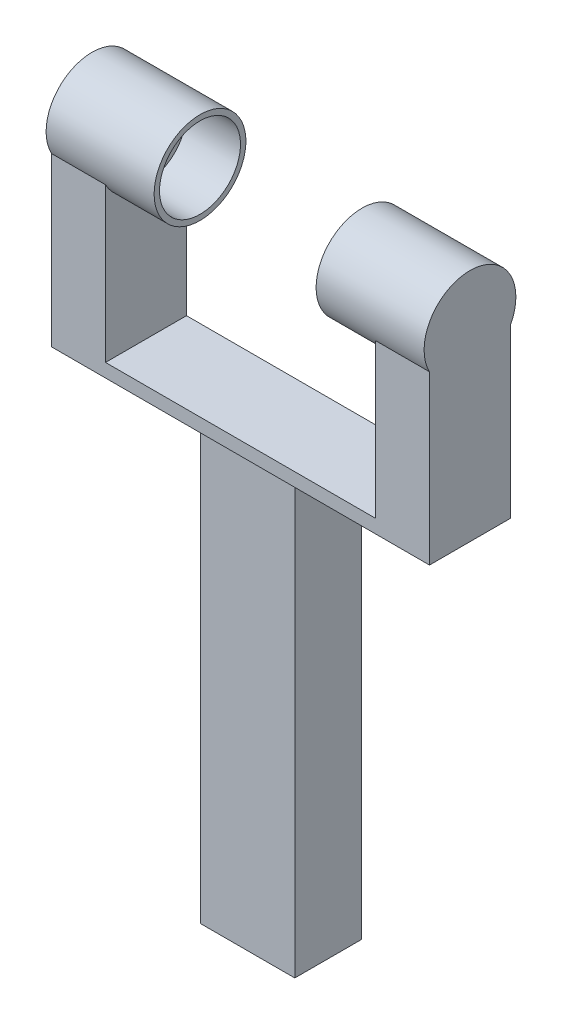
ISO-10303-21;
HEADER;
FILE_DESCRIPTION(('STEP AP214'),'2;1');
FILE_NAME('part.step','',(''),(''),'','','');
FILE_SCHEMA(('AUTOMOTIVE_DESIGN { 1 0 10303 214 1 1 1 1 }'));
ENDSEC;
DATA;
#1=APPLICATION_CONTEXT('core data for automotive mechanical design processes');
#2=APPLICATION_PROTOCOL_DEFINITION('international standard','automotive_design',2000,#1);
#3=PRODUCT_CONTEXT('',#1,'mechanical');
#4=PRODUCT('Part','Part','',(#3));
#5=PRODUCT_RELATED_PRODUCT_CATEGORY('part','',(#4));
#6=PRODUCT_DEFINITION_FORMATION('','',#4);
#7=PRODUCT_DEFINITION_CONTEXT('part definition',#1,'design');
#8=PRODUCT_DEFINITION('design','',#6,#7);
#9=PRODUCT_DEFINITION_SHAPE('','',#8);
#10=(LENGTH_UNIT() NAMED_UNIT(*) SI_UNIT(.MILLI.,.METRE.));
#11=(NAMED_UNIT(*) PLANE_ANGLE_UNIT() SI_UNIT($,.RADIAN.));
#12=(NAMED_UNIT(*) SI_UNIT($,.STERADIAN.) SOLID_ANGLE_UNIT());
#13=UNCERTAINTY_MEASURE_WITH_UNIT(LENGTH_MEASURE(1.E-05),#10,'distance_accuracy_value','');
#14=(GEOMETRIC_REPRESENTATION_CONTEXT(3) GLOBAL_UNCERTAINTY_ASSIGNED_CONTEXT((#13)) GLOBAL_UNIT_ASSIGNED_CONTEXT((#10,
#11,#12)) REPRESENTATION_CONTEXT('',''));
#15=CARTESIAN_POINT('',(0.,0.,0.));
#16=DIRECTION('',(0.,0.,1.));
#17=DIRECTION('',(1.,0.,0.));
#18=AXIS2_PLACEMENT_3D('',#15,#16,#17);
#19=CARTESIAN_POINT('',(0.,-5.,0.));
#20=DIRECTION('',(0.,1.,0.));
#21=DIRECTION('',(0.,0.,1.));
#22=AXIS2_PLACEMENT_3D('',#19,#20,#21);
#23=PLANE('',#22);
#24=DIRECTION('',(0.,0.,-1.));
#25=VECTOR('',#24,1.);
#26=CARTESIAN_POINT('',(70.,-5.,-15.));
#27=LINE('',#26,#25);
#28=CARTESIAN_POINT('',(70.,-5.,15.));
#29=VERTEX_POINT('',#28);
#30=CARTESIAN_POINT('',(70.,-5.,-15.));
#31=VERTEX_POINT('',#30);
#32=EDGE_CURVE('E498',#29,#31,#27,.T.);
#33=ORIENTED_EDGE('',*,*,#32,.F.);
#34=DIRECTION('',(1.,0.,0.));
#35=VECTOR('',#34,1.);
#36=CARTESIAN_POINT('',(-70.,-5.,15.));
#37=LINE('',#36,#35);
#38=CARTESIAN_POINT('',(-70.,-5.,15.));
#39=VERTEX_POINT('',#38);
#40=EDGE_CURVE('E511',#39,#29,#37,.T.);
#41=ORIENTED_EDGE('',*,*,#40,.F.);
#42=DIRECTION('',(0.,0.,1.));
#43=VECTOR('',#42,1.);
#44=CARTESIAN_POINT('',(-70.,-5.,-15.));
#45=LINE('',#44,#43);
#46=CARTESIAN_POINT('',(-70.,-5.,-15.));
#47=VERTEX_POINT('',#46);
#48=EDGE_CURVE('E507',#47,#39,#45,.T.);
#49=ORIENTED_EDGE('',*,*,#48,.F.);
#50=DIRECTION('',(-1.,0.,0.));
#51=VECTOR('',#50,1.);
#52=CARTESIAN_POINT('',(-70.,-5.,-15.));
#53=LINE('',#52,#51);
#54=EDGE_CURVE('E502',#31,#47,#53,.T.);
#55=ORIENTED_EDGE('',*,*,#54,.F.);
#56=EDGE_LOOP('',(#33,#41,#49,#55));
#57=FACE_BOUND('',#56,.T.);
#58=DIRECTION('',(0.,0.,1.));
#59=VECTOR('',#58,1.);
#60=CARTESIAN_POINT('',(17.5,-5.,-12.395));
#61=LINE('',#60,#59);
#62=CARTESIAN_POINT('',(17.5,-5.,-12.395));
#63=VERTEX_POINT('',#62);
#64=CARTESIAN_POINT('',(17.5,-5.,12.395));
#65=VERTEX_POINT('',#64);
#66=EDGE_CURVE('E130',#63,#65,#61,.T.);
#67=ORIENTED_EDGE('',*,*,#66,.F.);
#68=DIRECTION('',(1.,0.,0.));
#69=VECTOR('',#68,1.);
#70=CARTESIAN_POINT('',(-17.5,-5.,-12.395));
#71=LINE('',#70,#69);
#72=CARTESIAN_POINT('',(-17.5,-5.,-12.395));
#73=VERTEX_POINT('',#72);
#74=EDGE_CURVE('E134',#73,#63,#71,.T.);
#75=ORIENTED_EDGE('',*,*,#74,.F.);
#76=DIRECTION('',(0.,0.,-1.));
#77=VECTOR('',#76,1.);
#78=CARTESIAN_POINT('',(-17.5,-5.,-12.395));
#79=LINE('',#78,#77);
#80=CARTESIAN_POINT('',(-17.5,-5.,12.395));
#81=VERTEX_POINT('',#80);
#82=EDGE_CURVE('E1003',#81,#73,#79,.T.);
#83=ORIENTED_EDGE('',*,*,#82,.F.);
#84=DIRECTION('',(-1.,0.,0.));
#85=VECTOR('',#84,1.);
#86=CARTESIAN_POINT('',(-17.5,-5.,12.395));
#87=LINE('',#86,#85);
#88=EDGE_CURVE('E1013',#65,#81,#87,.T.);
#89=ORIENTED_EDGE('',*,*,#88,.F.);
#90=EDGE_LOOP('',(#67,#75,#83,#89));
#91=FACE_BOUND('',#90,.T.);
#92=ADVANCED_FACE('F110',(#57,#91),#23,.F.);
#93=CARTESIAN_POINT('',(-70.,-5.,15.));
#94=DIRECTION('',(0.,0.,1.));
#95=DIRECTION('',(1.,0.,0.));
#96=AXIS2_PLACEMENT_3D('',#93,#94,#95);
#97=PLANE('',#96);
#98=DIRECTION('',(0.,1.,0.));
#99=VECTOR('',#98,1.);
#100=CARTESIAN_POINT('',(70.,-5.,15.));
#101=LINE('',#100,#99);
#102=CARTESIAN_POINT('',(70.,57.,15.));
#103=VERTEX_POINT('',#102);
#104=EDGE_CURVE('E527',#29,#103,#101,.T.);
#105=ORIENTED_EDGE('',*,*,#104,.T.);
#106=DIRECTION('',(1.,0.,0.));
#107=VECTOR('',#106,1.);
#108=CARTESIAN_POINT('',(30.,57.,15.));
#109=LINE('',#108,#107);
#110=CARTESIAN_POINT('',(50.,57.,15.));
#111=VERTEX_POINT('',#110);
#112=EDGE_CURVE('E386',#103,#111,#109,.F.);
#113=ORIENTED_EDGE('',*,*,#112,.T.);
#114=DIRECTION('',(0.,-1.,0.));
#115=VECTOR('',#114,1.);
#116=CARTESIAN_POINT('',(50.,80.,15.));
#117=LINE('',#116,#115);
#118=CARTESIAN_POINT('',(50.,0.,15.));
#119=VERTEX_POINT('',#118);
#120=EDGE_CURVE('E114',#111,#119,#117,.T.);
#121=ORIENTED_EDGE('',*,*,#120,.T.);
#122=DIRECTION('',(1.,0.,0.));
#123=VECTOR('',#122,1.);
#124=CARTESIAN_POINT('',(-70.,0.,15.));
#125=LINE('',#124,#123);
#126=CARTESIAN_POINT('',(-50.,0.,15.));
#127=VERTEX_POINT('',#126);
#128=EDGE_CURVE('E503',#127,#119,#125,.T.);
#129=ORIENTED_EDGE('',*,*,#128,.F.);
#130=DIRECTION('',(0.,-1.,0.));
#131=VECTOR('',#130,1.);
#132=CARTESIAN_POINT('',(-50.,80.,15.));
#133=LINE('',#132,#131);
#134=CARTESIAN_POINT('',(-50.,57.,15.));
#135=VERTEX_POINT('',#134);
#136=EDGE_CURVE('E486',#135,#127,#133,.T.);
#137=ORIENTED_EDGE('',*,*,#136,.F.);
#138=DIRECTION('',(-1.,0.,0.));
#139=VECTOR('',#138,1.);
#140=CARTESIAN_POINT('',(-30.,57.,15.));
#141=LINE('',#140,#139);
#142=CARTESIAN_POINT('',(-70.,57.,15.));
#143=VERTEX_POINT('',#142);
#144=EDGE_CURVE('E448',#143,#135,#141,.F.);
#145=ORIENTED_EDGE('',*,*,#144,.F.);
#146=DIRECTION('',(0.,1.,0.));
#147=VECTOR('',#146,1.);
#148=CARTESIAN_POINT('',(-70.,-5.,15.));
#149=LINE('',#148,#147);
#150=EDGE_CURVE('E532',#39,#143,#149,.T.);
#151=ORIENTED_EDGE('',*,*,#150,.F.);
#152=ORIENTED_EDGE('',*,*,#40,.T.);
#153=EDGE_LOOP('',(#105,#113,#121,#129,#137,#145,#151,#152));
#154=FACE_BOUND('',#153,.T.);
#155=ADVANCED_FACE('F758',(#154),#97,.T.);
#156=CARTESIAN_POINT('',(-70.,-5.,-15.));
#157=DIRECTION('',(0.,0.,-1.));
#158=DIRECTION('',(-1.,0.,0.));
#159=AXIS2_PLACEMENT_3D('',#156,#157,#158);
#160=PLANE('',#159);
#161=DIRECTION('',(0.,-1.,0.));
#162=VECTOR('',#161,1.);
#163=CARTESIAN_POINT('',(50.,80.,-15.));
#164=LINE('',#163,#162);
#165=CARTESIAN_POINT('',(50.,57.,-15.));
#166=VERTEX_POINT('',#165);
#167=CARTESIAN_POINT('',(50.,0.,-15.));
#168=VERTEX_POINT('',#167);
#169=EDGE_CURVE('E605',#166,#168,#164,.T.);
#170=ORIENTED_EDGE('',*,*,#169,.F.);
#171=DIRECTION('',(1.,0.,0.));
#172=VECTOR('',#171,1.);
#173=CARTESIAN_POINT('',(30.,57.,-15.));
#174=LINE('',#173,#172);
#175=CARTESIAN_POINT('',(70.,57.,-15.));
#176=VERTEX_POINT('',#175);
#177=EDGE_CURVE('E382',#166,#176,#174,.T.);
#178=ORIENTED_EDGE('',*,*,#177,.T.);
#179=DIRECTION('',(0.,1.,0.));
#180=VECTOR('',#179,1.);
#181=CARTESIAN_POINT('',(70.,-5.,-15.));
#182=LINE('',#181,#180);
#183=EDGE_CURVE('E515',#31,#176,#182,.T.);
#184=ORIENTED_EDGE('',*,*,#183,.F.);
#185=ORIENTED_EDGE('',*,*,#54,.T.);
#186=DIRECTION('',(0.,1.,0.));
#187=VECTOR('',#186,1.);
#188=CARTESIAN_POINT('',(-70.,-5.,-15.));
#189=LINE('',#188,#187);
#190=CARTESIAN_POINT('',(-70.,57.,-15.));
#191=VERTEX_POINT('',#190);
#192=EDGE_CURVE('E533',#47,#191,#189,.T.);
#193=ORIENTED_EDGE('',*,*,#192,.T.);
#194=DIRECTION('',(-1.,0.,0.));
#195=VECTOR('',#194,1.);
#196=CARTESIAN_POINT('',(-30.,57.,-15.));
#197=LINE('',#196,#195);
#198=CARTESIAN_POINT('',(-50.,57.,-15.));
#199=VERTEX_POINT('',#198);
#200=EDGE_CURVE('E445',#199,#191,#197,.T.);
#201=ORIENTED_EDGE('',*,*,#200,.F.);
#202=DIRECTION('',(0.,-1.,0.));
#203=VECTOR('',#202,1.);
#204=CARTESIAN_POINT('',(-50.,80.,-15.));
#205=LINE('',#204,#203);
#206=CARTESIAN_POINT('',(-50.,0.,-15.));
#207=VERTEX_POINT('',#206);
#208=EDGE_CURVE('E491',#199,#207,#205,.T.);
#209=ORIENTED_EDGE('',*,*,#208,.T.);
#210=DIRECTION('',(-1.,0.,0.));
#211=VECTOR('',#210,1.);
#212=CARTESIAN_POINT('',(-70.,0.,-15.));
#213=LINE('',#212,#211);
#214=EDGE_CURVE('E490',#168,#207,#213,.T.);
#215=ORIENTED_EDGE('',*,*,#214,.F.);
#216=EDGE_LOOP('',(#170,#178,#184,#185,#193,#201,#209,#215));
#217=FACE_BOUND('',#216,.T.);
#218=ADVANCED_FACE('F763',(#217),#160,.T.);
#219=CARTESIAN_POINT('',(50.,80.,-15.));
#220=DIRECTION('',(1.,0.,0.));
#221=DIRECTION('',(0.,0.,-1.));
#222=AXIS2_PLACEMENT_3D('',#219,#220,#221);
#223=PLANE('',#222);
#224=CARTESIAN_POINT('',(50.,65.,0.));
#225=DIRECTION('',(1.,0.,0.));
#226=DIRECTION('',(0.,0.,-1.));
#227=AXIS2_PLACEMENT_3D('',#224,#225,#226);
#228=CIRCLE('',#227,17.);
#229=EDGE_CURVE('E379',#166,#111,#228,.F.);
#230=ORIENTED_EDGE('',*,*,#229,.F.);
#231=ORIENTED_EDGE('',*,*,#169,.T.);
#232=DIRECTION('',(0.,0.,1.));
#233=VECTOR('',#232,1.);
#234=CARTESIAN_POINT('',(50.,0.,-15.));
#235=LINE('',#234,#233);
#236=EDGE_CURVE('E620',#168,#119,#235,.T.);
#237=ORIENTED_EDGE('',*,*,#236,.T.);
#238=ORIENTED_EDGE('',*,*,#120,.F.);
#239=EDGE_LOOP('',(#230,#231,#237,#238));
#240=FACE_BOUND('',#239,.T.);
#241=ADVANCED_FACE('F709',(#240),#223,.F.);
#242=CARTESIAN_POINT('',(0.,0.,0.));
#243=DIRECTION('',(0.,1.,0.));
#244=DIRECTION('',(0.,0.,1.));
#245=AXIS2_PLACEMENT_3D('',#242,#243,#244);
#246=PLANE('',#245);
#247=ORIENTED_EDGE('',*,*,#128,.T.);
#248=ORIENTED_EDGE('',*,*,#236,.F.);
#249=ORIENTED_EDGE('',*,*,#214,.T.);
#250=DIRECTION('',(0.,0.,-1.));
#251=VECTOR('',#250,1.);
#252=CARTESIAN_POINT('',(-50.,0.,-15.));
#253=LINE('',#252,#251);
#254=EDGE_CURVE('E786',#127,#207,#253,.T.);
#255=ORIENTED_EDGE('',*,*,#254,.F.);
#256=EDGE_LOOP('',(#247,#248,#249,#255));
#257=FACE_BOUND('',#256,.T.);
#258=ADVANCED_FACE('F699',(#257),#246,.T.);
#259=CARTESIAN_POINT('',(70.,-5.,-15.));
#260=DIRECTION('',(1.,0.,0.));
#261=DIRECTION('',(0.,0.,-1.));
#262=AXIS2_PLACEMENT_3D('',#259,#260,#261);
#263=PLANE('',#262);
#264=CARTESIAN_POINT('',(70.,65.,0.));
#265=DIRECTION('',(-1.,0.,0.));
#266=DIRECTION('',(0.,0.,1.));
#267=AXIS2_PLACEMENT_3D('',#264,#265,#266);
#268=CIRCLE('',#267,17.);
#269=EDGE_CURVE('E328',#103,#176,#268,.T.);
#270=ORIENTED_EDGE('',*,*,#269,.F.);
#271=ORIENTED_EDGE('',*,*,#104,.F.);
#272=ORIENTED_EDGE('',*,*,#32,.T.);
#273=ORIENTED_EDGE('',*,*,#183,.T.);
#274=EDGE_LOOP('',(#270,#271,#272,#273));
#275=FACE_BOUND('',#274,.T.);
#276=ADVANCED_FACE('F112',(#275),#263,.T.);
#277=CARTESIAN_POINT('',(-70.,-5.,-15.));
#278=DIRECTION('',(-1.,0.,0.));
#279=DIRECTION('',(0.,0.,1.));
#280=AXIS2_PLACEMENT_3D('',#277,#278,#279);
#281=PLANE('',#280);
#282=ORIENTED_EDGE('',*,*,#150,.T.);
#283=CARTESIAN_POINT('',(-70.,65.,0.));
#284=DIRECTION('',(-1.,0.,0.));
#285=DIRECTION('',(0.,0.,1.));
#286=AXIS2_PLACEMENT_3D('',#283,#284,#285);
#287=CIRCLE('',#286,17.);
#288=EDGE_CURVE('E394',#143,#191,#287,.T.);
#289=ORIENTED_EDGE('',*,*,#288,.T.);
#290=ORIENTED_EDGE('',*,*,#192,.F.);
#291=ORIENTED_EDGE('',*,*,#48,.T.);
#292=EDGE_LOOP('',(#282,#289,#290,#291));
#293=FACE_BOUND('',#292,.T.);
#294=ADVANCED_FACE('F754',(#293),#281,.T.);
#295=CARTESIAN_POINT('',(-50.,80.,-15.));
#296=DIRECTION('',(-1.,0.,0.));
#297=DIRECTION('',(0.,0.,1.));
#298=AXIS2_PLACEMENT_3D('',#295,#296,#297);
#299=PLANE('',#298);
#300=ORIENTED_EDGE('',*,*,#208,.F.);
#301=CARTESIAN_POINT('',(-50.,65.,0.));
#302=DIRECTION('',(-1.,0.,0.));
#303=DIRECTION('',(0.,0.,1.));
#304=AXIS2_PLACEMENT_3D('',#301,#302,#303);
#305=CIRCLE('',#304,17.);
#306=EDGE_CURVE('E441',#199,#135,#305,.T.);
#307=ORIENTED_EDGE('',*,*,#306,.T.);
#308=ORIENTED_EDGE('',*,*,#136,.T.);
#309=ORIENTED_EDGE('',*,*,#254,.T.);
#310=EDGE_LOOP('',(#300,#307,#308,#309));
#311=FACE_BOUND('',#310,.T.);
#312=ADVANCED_FACE('F751',(#311),#299,.F.);
#313=CARTESIAN_POINT('',(-30.,65.,0.));
#314=DIRECTION('',(-1.,0.,0.));
#315=DIRECTION('',(0.,0.,1.));
#316=AXIS2_PLACEMENT_3D('',#313,#314,#315);
#317=PLANE('',#316);
#318=CARTESIAN_POINT('',(-30.,65.,0.));
#319=DIRECTION('',(-1.,0.,0.));
#320=DIRECTION('',(0.,0.,1.));
#321=AXIS2_PLACEMENT_3D('',#318,#319,#320);
#322=CIRCLE('',#321,15.);
#323=CARTESIAN_POINT('',(-30.,65.,15.));
#324=VERTEX_POINT('',#323);
#325=EDGE_CURVE('E390',#324,#324,#322,.T.);
#326=ORIENTED_EDGE('',*,*,#325,.T.);
#327=EDGE_LOOP('',(#326));
#328=FACE_BOUND('',#327,.T.);
#329=CARTESIAN_POINT('',(-30.,65.,0.));
#330=DIRECTION('',(-1.,0.,0.));
#331=DIRECTION('',(0.,0.,1.));
#332=AXIS2_PLACEMENT_3D('',#329,#330,#331);
#333=CIRCLE('',#332,17.);
#334=CARTESIAN_POINT('',(-30.,65.,17.));
#335=VERTEX_POINT('',#334);
#336=EDGE_CURVE('E395',#335,#335,#333,.T.);
#337=ORIENTED_EDGE('',*,*,#336,.F.);
#338=EDGE_LOOP('',(#337));
#339=FACE_BOUND('',#338,.T.);
#340=ADVANCED_FACE('F753',(#328,#339),#317,.F.);
#341=CARTESIAN_POINT('',(-30.,65.,0.));
#342=DIRECTION('',(-1.,0.,0.));
#343=DIRECTION('',(0.,0.,1.));
#344=AXIS2_PLACEMENT_3D('',#341,#342,#343);
#345=CYLINDRICAL_SURFACE('',#344,15.);
#346=ORIENTED_EDGE('',*,*,#325,.F.);
#347=EDGE_LOOP('',(#346));
#348=FACE_BOUND('',#347,.T.);
#349=CARTESIAN_POINT('',(-50.,65.,0.));
#350=DIRECTION('',(-1.,0.,0.));
#351=DIRECTION('',(0.,0.,1.));
#352=AXIS2_PLACEMENT_3D('',#349,#350,#351);
#353=CIRCLE('',#352,15.);
#354=CARTESIAN_POINT('',(-50.,65.,15.));
#355=VERTEX_POINT('',#354);
#356=EDGE_CURVE('E399',#355,#355,#353,.T.);
#357=ORIENTED_EDGE('',*,*,#356,.T.);
#358=EDGE_LOOP('',(#357));
#359=FACE_BOUND('',#358,.T.);
#360=ADVANCED_FACE('F1021',(#348,#359),#345,.F.);
#361=CARTESIAN_POINT('',(-30.,65.,0.));
#362=DIRECTION('',(-1.,0.,0.));
#363=DIRECTION('',(0.,0.,1.));
#364=AXIS2_PLACEMENT_3D('',#361,#362,#363);
#365=CYLINDRICAL_SURFACE('',#364,17.);
#366=ORIENTED_EDGE('',*,*,#288,.F.);
#367=ORIENTED_EDGE('',*,*,#144,.T.);
#368=ORIENTED_EDGE('',*,*,#306,.F.);
#369=ORIENTED_EDGE('',*,*,#200,.T.);
#370=EDGE_LOOP('',(#366,#367,#368,#369));
#371=FACE_BOUND('',#370,.T.);
#372=ORIENTED_EDGE('',*,*,#336,.T.);
#373=EDGE_LOOP('',(#372));
#374=FACE_BOUND('',#373,.T.);
#375=ADVANCED_FACE('F723',(#371,#374),#365,.T.);
#376=ORIENTED_EDGE('',*,*,#356,.F.);
#377=EDGE_LOOP('',(#376));
#378=FACE_BOUND('',#377,.T.);
#379=ADVANCED_FACE('F756',(#378),#299,.F.);
#380=CARTESIAN_POINT('',(30.,65.,0.));
#381=DIRECTION('',(-1.,0.,0.));
#382=DIRECTION('',(0.,0.,1.));
#383=AXIS2_PLACEMENT_3D('',#380,#381,#382);
#384=PLANE('',#383);
#385=CARTESIAN_POINT('',(30.,65.,0.));
#386=DIRECTION('',(-1.,0.,0.));
#387=DIRECTION('',(0.,0.,1.));
#388=AXIS2_PLACEMENT_3D('',#385,#386,#387);
#389=CIRCLE('',#388,17.);
#390=CARTESIAN_POINT('',(30.,65.,17.));
#391=VERTEX_POINT('',#390);
#392=EDGE_CURVE('E334',#391,#391,#389,.T.);
#393=ORIENTED_EDGE('',*,*,#392,.T.);
#394=EDGE_LOOP('',(#393));
#395=FACE_BOUND('',#394,.T.);
#396=CARTESIAN_POINT('',(30.,65.,0.));
#397=DIRECTION('',(-1.,0.,0.));
#398=DIRECTION('',(0.,0.,1.));
#399=AXIS2_PLACEMENT_3D('',#396,#397,#398);
#400=CIRCLE('',#399,15.);
#401=CARTESIAN_POINT('',(30.,65.,15.));
#402=VERTEX_POINT('',#401);
#403=EDGE_CURVE('E323',#402,#402,#400,.T.);
#404=ORIENTED_EDGE('',*,*,#403,.F.);
#405=EDGE_LOOP('',(#404));
#406=FACE_BOUND('',#405,.T.);
#407=ADVANCED_FACE('F846',(#395,#406),#384,.T.);
#408=CARTESIAN_POINT('',(30.,65.,0.));
#409=DIRECTION('',(1.,0.,0.));
#410=DIRECTION('',(0.,0.,-1.));
#411=AXIS2_PLACEMENT_3D('',#408,#409,#410);
#412=CYLINDRICAL_SURFACE('',#411,15.);
#413=ORIENTED_EDGE('',*,*,#403,.T.);
#414=EDGE_LOOP('',(#413));
#415=FACE_BOUND('',#414,.T.);
#416=CARTESIAN_POINT('',(50.,65.,0.));
#417=DIRECTION('',(1.,0.,0.));
#418=DIRECTION('',(0.,0.,-1.));
#419=AXIS2_PLACEMENT_3D('',#416,#417,#418);
#420=CIRCLE('',#419,15.);
#421=CARTESIAN_POINT('',(50.,65.,-15.));
#422=VERTEX_POINT('',#421);
#423=EDGE_CURVE('E338',#422,#422,#420,.F.);
#424=ORIENTED_EDGE('',*,*,#423,.F.);
#425=EDGE_LOOP('',(#424));
#426=FACE_BOUND('',#425,.T.);
#427=ADVANCED_FACE('F694',(#415,#426),#412,.F.);
#428=CARTESIAN_POINT('',(30.,65.,0.));
#429=DIRECTION('',(1.,0.,0.));
#430=DIRECTION('',(0.,0.,-1.));
#431=AXIS2_PLACEMENT_3D('',#428,#429,#430);
#432=CYLINDRICAL_SURFACE('',#431,17.);
#433=ORIENTED_EDGE('',*,*,#112,.F.);
#434=ORIENTED_EDGE('',*,*,#269,.T.);
#435=ORIENTED_EDGE('',*,*,#177,.F.);
#436=ORIENTED_EDGE('',*,*,#229,.T.);
#437=EDGE_LOOP('',(#433,#434,#435,#436));
#438=FACE_BOUND('',#437,.T.);
#439=ORIENTED_EDGE('',*,*,#392,.F.);
#440=EDGE_LOOP('',(#439));
#441=FACE_BOUND('',#440,.T.);
#442=ADVANCED_FACE('F682',(#438,#441),#432,.T.);
#443=ORIENTED_EDGE('',*,*,#423,.T.);
#444=EDGE_LOOP('',(#443));
#445=FACE_BOUND('',#444,.T.);
#446=ADVANCED_FACE('F693',(#445),#223,.F.);
#447=CARTESIAN_POINT('',(17.5,-165.,-12.395));
#448=DIRECTION('',(-1.,0.,0.));
#449=DIRECTION('',(0.,0.,1.));
#450=AXIS2_PLACEMENT_3D('',#447,#448,#449);
#451=PLANE('',#450);
#452=ORIENTED_EDGE('',*,*,#66,.T.);
#453=DIRECTION('',(0.,1.,0.));
#454=VECTOR('',#453,1.);
#455=CARTESIAN_POINT('',(17.5,-165.,12.395));
#456=LINE('',#455,#454);
#457=CARTESIAN_POINT('',(17.5,-165.,12.395));
#458=VERTEX_POINT('',#457);
#459=EDGE_CURVE('E303',#458,#65,#456,.T.);
#460=ORIENTED_EDGE('',*,*,#459,.F.);
#461=DIRECTION('',(0.,0.,1.));
#462=VECTOR('',#461,1.);
#463=CARTESIAN_POINT('',(17.5,-165.,-12.395));
#464=LINE('',#463,#462);
#465=CARTESIAN_POINT('',(17.5,-165.,-12.395));
#466=VERTEX_POINT('',#465);
#467=EDGE_CURVE('E310',#466,#458,#464,.T.);
#468=ORIENTED_EDGE('',*,*,#467,.F.);
#469=DIRECTION('',(0.,1.,0.));
#470=VECTOR('',#469,1.);
#471=CARTESIAN_POINT('',(17.5,-165.,-12.395));
#472=LINE('',#471,#470);
#473=EDGE_CURVE('E1000',#466,#63,#472,.T.);
#474=ORIENTED_EDGE('',*,*,#473,.T.);
#475=EDGE_LOOP('',(#452,#460,#468,#474));
#476=FACE_BOUND('',#475,.T.);
#477=ADVANCED_FACE('F321',(#476),#451,.F.);
#478=CARTESIAN_POINT('',(-17.5,-165.,12.395));
#479=DIRECTION('',(0.,0.,-1.));
#480=DIRECTION('',(-1.,0.,0.));
#481=AXIS2_PLACEMENT_3D('',#478,#479,#480);
#482=PLANE('',#481);
#483=ORIENTED_EDGE('',*,*,#88,.T.);
#484=DIRECTION('',(0.,1.,0.));
#485=VECTOR('',#484,1.);
#486=CARTESIAN_POINT('',(-17.5,-165.,12.395));
#487=LINE('',#486,#485);
#488=CARTESIAN_POINT('',(-17.5,-165.,12.395));
#489=VERTEX_POINT('',#488);
#490=EDGE_CURVE('E305',#489,#81,#487,.T.);
#491=ORIENTED_EDGE('',*,*,#490,.F.);
#492=DIRECTION('',(-1.,0.,0.));
#493=VECTOR('',#492,1.);
#494=CARTESIAN_POINT('',(-17.5,-165.,12.395));
#495=LINE('',#494,#493);
#496=EDGE_CURVE('E298',#458,#489,#495,.T.);
#497=ORIENTED_EDGE('',*,*,#496,.F.);
#498=ORIENTED_EDGE('',*,*,#459,.T.);
#499=EDGE_LOOP('',(#483,#491,#497,#498));
#500=FACE_BOUND('',#499,.T.);
#501=ADVANCED_FACE('F301',(#500),#482,.F.);
#502=CARTESIAN_POINT('',(-17.5,-165.,-12.395));
#503=DIRECTION('',(1.,0.,0.));
#504=DIRECTION('',(0.,0.,-1.));
#505=AXIS2_PLACEMENT_3D('',#502,#503,#504);
#506=PLANE('',#505);
#507=ORIENTED_EDGE('',*,*,#82,.T.);
#508=DIRECTION('',(0.,1.,0.));
#509=VECTOR('',#508,1.);
#510=CARTESIAN_POINT('',(-17.5,-165.,-12.395));
#511=LINE('',#510,#509);
#512=CARTESIAN_POINT('',(-17.5,-165.,-12.395));
#513=VERTEX_POINT('',#512);
#514=EDGE_CURVE('E330',#513,#73,#511,.T.);
#515=ORIENTED_EDGE('',*,*,#514,.F.);
#516=DIRECTION('',(0.,0.,-1.));
#517=VECTOR('',#516,1.);
#518=CARTESIAN_POINT('',(-17.5,-165.,-12.395));
#519=LINE('',#518,#517);
#520=EDGE_CURVE('E309',#489,#513,#519,.T.);
#521=ORIENTED_EDGE('',*,*,#520,.F.);
#522=ORIENTED_EDGE('',*,*,#490,.T.);
#523=EDGE_LOOP('',(#507,#515,#521,#522));
#524=FACE_BOUND('',#523,.T.);
#525=ADVANCED_FACE('F969',(#524),#506,.F.);
#526=CARTESIAN_POINT('',(-17.5,-165.,-12.395));
#527=DIRECTION('',(0.,0.,1.));
#528=DIRECTION('',(1.,0.,0.));
#529=AXIS2_PLACEMENT_3D('',#526,#527,#528);
#530=PLANE('',#529);
#531=ORIENTED_EDGE('',*,*,#74,.T.);
#532=ORIENTED_EDGE('',*,*,#473,.F.);
#533=DIRECTION('',(1.,0.,0.));
#534=VECTOR('',#533,1.);
#535=CARTESIAN_POINT('',(-17.5,-165.,-12.395));
#536=LINE('',#535,#534);
#537=EDGE_CURVE('E315',#513,#466,#536,.T.);
#538=ORIENTED_EDGE('',*,*,#537,.F.);
#539=ORIENTED_EDGE('',*,*,#514,.T.);
#540=EDGE_LOOP('',(#531,#532,#538,#539));
#541=FACE_BOUND('',#540,.T.);
#542=ADVANCED_FACE('F978',(#541),#530,.F.);
#543=CARTESIAN_POINT('',(0.,-165.,0.));
#544=DIRECTION('',(0.,1.,0.));
#545=DIRECTION('',(0.,0.,1.));
#546=AXIS2_PLACEMENT_3D('',#543,#544,#545);
#547=PLANE('',#546);
#548=ORIENTED_EDGE('',*,*,#467,.T.);
#549=ORIENTED_EDGE('',*,*,#496,.T.);
#550=ORIENTED_EDGE('',*,*,#520,.T.);
#551=ORIENTED_EDGE('',*,*,#537,.T.);
#552=EDGE_LOOP('',(#548,#549,#550,#551));
#553=FACE_BOUND('',#552,.T.);
#554=ADVANCED_FACE('F313',(#553),#547,.F.);
#555=CLOSED_SHELL('',(#92,#155,#218,#241,#258,#276,#294,#312,#340,#360,#375,#379,#407,#427,#442,
#446,#477,#501,#525,#542,#554));
#556=DIRECTION('',(0.,0.,-1.));
#557=VECTOR('',#556,1.);
#558=CARTESIAN_POINT('',(68.,0.,0.));
#559=LINE('',#558,#557);
#560=CARTESIAN_POINT('',(68.,0.,13.));
#561=VERTEX_POINT('',#560);
#562=CARTESIAN_POINT('',(68.,0.,-13.));
#563=VERTEX_POINT('',#562);
#564=EDGE_CURVE('E451',#561,#563,#559,.T.);
#565=ORIENTED_EDGE('',*,*,#564,.T.);
#566=DIRECTION('',(-1.,0.,0.));
#567=VECTOR('',#566,1.);
#568=CARTESIAN_POINT('',(0.,0.,-13.));
#569=LINE('',#568,#567);
#570=CARTESIAN_POINT('',(52.,0.,-13.));
#571=VERTEX_POINT('',#570);
#572=EDGE_CURVE('E455',#563,#571,#569,.T.);
#573=ORIENTED_EDGE('',*,*,#572,.T.);
#574=DIRECTION('',(0.,0.,1.));
#575=VECTOR('',#574,1.);
#576=CARTESIAN_POINT('',(52.,0.,0.));
#577=LINE('',#576,#575);
#578=CARTESIAN_POINT('',(52.,0.,13.));
#579=VERTEX_POINT('',#578);
#580=EDGE_CURVE('E459',#571,#579,#577,.T.);
#581=ORIENTED_EDGE('',*,*,#580,.T.);
#582=DIRECTION('',(1.,0.,0.));
#583=VECTOR('',#582,1.);
#584=CARTESIAN_POINT('',(0.,0.,13.));
#585=LINE('',#584,#583);
#586=EDGE_CURVE('E463',#579,#561,#585,.T.);
#587=ORIENTED_EDGE('',*,*,#586,.T.);
#588=EDGE_LOOP('',(#565,#573,#581,#587));
#589=FACE_BOUND('',#588,.T.);
#590=ADVANCED_FACE('F668',(#589),#246,.T.);
#591=CARTESIAN_POINT('',(0.,80.,13.));
#592=DIRECTION('',(0.,0.,-1.));
#593=DIRECTION('',(-1.,0.,0.));
#594=AXIS2_PLACEMENT_3D('',#591,#592,#593);
#595=PLANE('',#594);
#596=DIRECTION('',(0.,-1.,0.));
#597=VECTOR('',#596,1.);
#598=CARTESIAN_POINT('',(52.,80.,13.));
#599=LINE('',#598,#597);
#600=CARTESIAN_POINT('',(52.,54.0455488498967,13.));
#601=VERTEX_POINT('',#600);
#602=EDGE_CURVE('E478',#601,#579,#599,.T.);
#603=ORIENTED_EDGE('',*,*,#602,.F.);
#604=DIRECTION('',(1.,0.,0.));
#605=VECTOR('',#604,1.);
#606=CARTESIAN_POINT('',(30.,54.0455488498967,13.));
#607=LINE('',#606,#605);
#608=CARTESIAN_POINT('',(68.,54.0455488498967,13.));
#609=VERTEX_POINT('',#608);
#610=EDGE_CURVE('E14',#601,#609,#607,.T.);
#611=ORIENTED_EDGE('',*,*,#610,.T.);
#612=DIRECTION('',(0.,-1.,0.));
#613=VECTOR('',#612,1.);
#614=CARTESIAN_POINT('',(68.,80.,13.));
#615=LINE('',#614,#613);
#616=EDGE_CURVE('E467',#609,#561,#615,.T.);
#617=ORIENTED_EDGE('',*,*,#616,.T.);
#618=ORIENTED_EDGE('',*,*,#586,.F.);
#619=EDGE_LOOP('',(#603,#611,#617,#618));
#620=FACE_BOUND('',#619,.T.);
#621=ADVANCED_FACE('F674',(#620),#595,.T.);
#622=CARTESIAN_POINT('',(52.,80.,0.));
#623=DIRECTION('',(1.,0.,0.));
#624=DIRECTION('',(0.,0.,-1.));
#625=AXIS2_PLACEMENT_3D('',#622,#623,#624);
#626=PLANE('',#625);
#627=DIRECTION('',(0.,-1.,0.));
#628=VECTOR('',#627,1.);
#629=CARTESIAN_POINT('',(52.,80.,-13.));
#630=LINE('',#629,#628);
#631=CARTESIAN_POINT('',(52.,54.0455488498967,-13.));
#632=VERTEX_POINT('',#631);
#633=EDGE_CURVE('E485',#632,#571,#630,.T.);
#634=ORIENTED_EDGE('',*,*,#633,.F.);
#635=CARTESIAN_POINT('',(52.,65.,0.));
#636=DIRECTION('',(1.,0.,0.));
#637=DIRECTION('',(0.,0.,-1.));
#638=AXIS2_PLACEMENT_3D('',#635,#636,#637);
#639=CIRCLE('',#638,17.);
#640=EDGE_CURVE('E367',#632,#601,#639,.F.);
#641=ORIENTED_EDGE('',*,*,#640,.T.);
#642=ORIENTED_EDGE('',*,*,#602,.T.);
#643=ORIENTED_EDGE('',*,*,#580,.F.);
#644=EDGE_LOOP('',(#634,#641,#642,#643));
#645=FACE_BOUND('',#644,.T.);
#646=ADVANCED_FACE('F671',(#645),#626,.T.);
#647=CARTESIAN_POINT('',(0.,80.,-13.));
#648=DIRECTION('',(0.,0.,1.));
#649=DIRECTION('',(1.,0.,0.));
#650=AXIS2_PLACEMENT_3D('',#647,#648,#649);
#651=PLANE('',#650);
#652=DIRECTION('',(0.,-1.,0.));
#653=VECTOR('',#652,1.);
#654=CARTESIAN_POINT('',(68.,80.,-13.));
#655=LINE('',#654,#653);
#656=CARTESIAN_POINT('',(68.,54.0455488498967,-13.));
#657=VERTEX_POINT('',#656);
#658=EDGE_CURVE('E611',#657,#563,#655,.T.);
#659=ORIENTED_EDGE('',*,*,#658,.F.);
#660=DIRECTION('',(1.,0.,0.));
#661=VECTOR('',#660,1.);
#662=CARTESIAN_POINT('',(30.,54.0455488498967,-13.));
#663=LINE('',#662,#661);
#664=EDGE_CURVE('E371',#657,#632,#663,.F.);
#665=ORIENTED_EDGE('',*,*,#664,.T.);
#666=ORIENTED_EDGE('',*,*,#633,.T.);
#667=ORIENTED_EDGE('',*,*,#572,.F.);
#668=EDGE_LOOP('',(#659,#665,#666,#667));
#669=FACE_BOUND('',#668,.T.);
#670=ADVANCED_FACE('F664',(#669),#651,.T.);
#671=CARTESIAN_POINT('',(68.,80.,0.));
#672=DIRECTION('',(-1.,0.,0.));
#673=DIRECTION('',(0.,0.,1.));
#674=AXIS2_PLACEMENT_3D('',#671,#672,#673);
#675=PLANE('',#674);
#676=ORIENTED_EDGE('',*,*,#616,.F.);
#677=CARTESIAN_POINT('',(68.,65.,0.));
#678=DIRECTION('',(-1.,0.,0.));
#679=DIRECTION('',(0.,0.,1.));
#680=AXIS2_PLACEMENT_3D('',#677,#678,#679);
#681=CIRCLE('',#680,17.);
#682=EDGE_CURVE('E375',#609,#657,#681,.F.);
#683=ORIENTED_EDGE('',*,*,#682,.T.);
#684=ORIENTED_EDGE('',*,*,#658,.T.);
#685=ORIENTED_EDGE('',*,*,#564,.F.);
#686=EDGE_LOOP('',(#676,#683,#684,#685));
#687=FACE_BOUND('',#686,.T.);
#688=ADVANCED_FACE('F677',(#687),#675,.T.);
#689=ORIENTED_EDGE('',*,*,#682,.F.);
#690=ORIENTED_EDGE('',*,*,#610,.F.);
#691=ORIENTED_EDGE('',*,*,#640,.F.);
#692=ORIENTED_EDGE('',*,*,#664,.F.);
#693=EDGE_LOOP('',(#689,#690,#691,#692));
#694=FACE_BOUND('',#693,.T.);
#695=ADVANCED_FACE('F679',(#694),#432,.T.);
#696=CLOSED_SHELL('',(#590,#621,#646,#670,#688,#695));
#697=DIRECTION('',(1.,0.,0.));
#698=VECTOR('',#697,1.);
#699=CARTESIAN_POINT('',(30.,57.5166852264521,13.));
#700=LINE('',#699,#698);
#701=CARTESIAN_POINT('',(52.,57.5166852264521,13.));
#702=VERTEX_POINT('',#701);
#703=CARTESIAN_POINT('',(68.,57.5166852264521,13.));
#704=VERTEX_POINT('',#703);
#705=EDGE_CURVE('E351',#702,#704,#700,.T.);
#706=ORIENTED_EDGE('',*,*,#705,.T.);
#707=CARTESIAN_POINT('',(68.,65.,0.));
#708=DIRECTION('',(-1.,0.,0.));
#709=DIRECTION('',(0.,0.,1.));
#710=AXIS2_PLACEMENT_3D('',#707,#708,#709);
#711=CIRCLE('',#710,15.);
#712=CARTESIAN_POINT('',(68.,57.5166852264521,-13.));
#713=VERTEX_POINT('',#712);
#714=EDGE_CURVE('E366',#704,#713,#711,.F.);
#715=ORIENTED_EDGE('',*,*,#714,.T.);
#716=DIRECTION('',(1.,0.,0.));
#717=VECTOR('',#716,1.);
#718=CARTESIAN_POINT('',(30.,57.5166852264521,-13.));
#719=LINE('',#718,#717);
#720=CARTESIAN_POINT('',(52.,57.5166852264521,-13.));
#721=VERTEX_POINT('',#720);
#722=EDGE_CURVE('E350',#713,#721,#719,.F.);
#723=ORIENTED_EDGE('',*,*,#722,.T.);
#724=CARTESIAN_POINT('',(52.,65.,0.));
#725=DIRECTION('',(1.,0.,0.));
#726=DIRECTION('',(0.,0.,-1.));
#727=AXIS2_PLACEMENT_3D('',#724,#725,#726);
#728=CIRCLE('',#727,15.);
#729=EDGE_CURVE('E345',#721,#702,#728,.F.);
#730=ORIENTED_EDGE('',*,*,#729,.T.);
#731=EDGE_LOOP('',(#706,#715,#723,#730));
#732=FACE_BOUND('',#731,.T.);
#733=ADVANCED_FACE('F641',(#732),#412,.F.);
#734=DIRECTION('',(1.,0.,0.));
#735=VECTOR('',#734,1.);
#736=CARTESIAN_POINT('',(30.,72.4833147735479,13.));
#737=LINE('',#736,#735);
#738=CARTESIAN_POINT('',(68.,72.4833147735479,13.));
#739=VERTEX_POINT('',#738);
#740=CARTESIAN_POINT('',(52.,72.4833147735479,13.));
#741=VERTEX_POINT('',#740);
#742=EDGE_CURVE('E358',#739,#741,#737,.F.);
#743=ORIENTED_EDGE('',*,*,#742,.F.);
#744=EDGE_CURVE('E475',#739,#704,#615,.T.);
#745=ORIENTED_EDGE('',*,*,#744,.T.);
#746=ORIENTED_EDGE('',*,*,#705,.F.);
#747=EDGE_CURVE('E481',#741,#702,#599,.T.);
#748=ORIENTED_EDGE('',*,*,#747,.F.);
#749=EDGE_LOOP('',(#743,#745,#746,#748));
#750=FACE_BOUND('',#749,.T.);
#751=ADVANCED_FACE('F705',(#750),#595,.T.);
#752=ORIENTED_EDGE('',*,*,#729,.F.);
#753=CARTESIAN_POINT('',(52.,72.4833147735479,-13.));
#754=VERTEX_POINT('',#753);
#755=EDGE_CURVE('E616',#754,#721,#630,.T.);
#756=ORIENTED_EDGE('',*,*,#755,.F.);
#757=EDGE_CURVE('E354',#741,#754,#728,.F.);
#758=ORIENTED_EDGE('',*,*,#757,.F.);
#759=ORIENTED_EDGE('',*,*,#747,.T.);
#760=EDGE_LOOP('',(#752,#756,#758,#759));
#761=FACE_BOUND('',#760,.T.);
#762=ADVANCED_FACE('F656',(#761),#626,.T.);
#763=ORIENTED_EDGE('',*,*,#722,.F.);
#764=CARTESIAN_POINT('',(68.,72.4833147735479,-13.));
#765=VERTEX_POINT('',#764);
#766=EDGE_CURVE('E615',#765,#713,#655,.T.);
#767=ORIENTED_EDGE('',*,*,#766,.F.);
#768=DIRECTION('',(1.,0.,0.));
#769=VECTOR('',#768,1.);
#770=CARTESIAN_POINT('',(30.,72.4833147735479,-13.));
#771=LINE('',#770,#769);
#772=EDGE_CURVE('E344',#754,#765,#771,.T.);
#773=ORIENTED_EDGE('',*,*,#772,.F.);
#774=ORIENTED_EDGE('',*,*,#755,.T.);
#775=EDGE_LOOP('',(#763,#767,#773,#774));
#776=FACE_BOUND('',#775,.T.);
#777=ADVANCED_FACE('F654',(#776),#651,.T.);
#778=ORIENTED_EDGE('',*,*,#714,.F.);
#779=ORIENTED_EDGE('',*,*,#744,.F.);
#780=EDGE_CURVE('E636',#765,#739,#711,.F.);
#781=ORIENTED_EDGE('',*,*,#780,.F.);
#782=ORIENTED_EDGE('',*,*,#766,.T.);
#783=EDGE_LOOP('',(#778,#779,#781,#782));
#784=FACE_BOUND('',#783,.T.);
#785=ADVANCED_FACE('F634',(#784),#675,.T.);
#786=ORIENTED_EDGE('',*,*,#742,.T.);
#787=ORIENTED_EDGE('',*,*,#757,.T.);
#788=ORIENTED_EDGE('',*,*,#772,.T.);
#789=ORIENTED_EDGE('',*,*,#780,.T.);
#790=EDGE_LOOP('',(#786,#787,#788,#789));
#791=FACE_BOUND('',#790,.T.);
#792=ADVANCED_FACE('F650',(#791),#412,.F.);
#793=CLOSED_SHELL('',(#733,#751,#762,#777,#785,#792));
#794=CARTESIAN_POINT('',(-70.,80.,-13.));
#795=DIRECTION('',(0.,0.,1.));
#796=DIRECTION('',(1.,0.,0.));
#797=AXIS2_PLACEMENT_3D('',#794,#795,#796);
#798=PLANE('',#797);
#799=DIRECTION('',(0.,-1.,0.));
#800=VECTOR('',#799,1.);
#801=CARTESIAN_POINT('',(-52.,80.,-13.));
#802=LINE('',#801,#800);
#803=CARTESIAN_POINT('',(-52.,72.4833147735479,-13.));
#804=VERTEX_POINT('',#803);
#805=CARTESIAN_POINT('',(-52.,57.5166852264521,-13.));
#806=VERTEX_POINT('',#805);
#807=EDGE_CURVE('E538',#804,#806,#802,.T.);
#808=ORIENTED_EDGE('',*,*,#807,.F.);
#809=DIRECTION('',(-1.,0.,0.));
#810=VECTOR('',#809,1.);
#811=CARTESIAN_POINT('',(-30.,72.4833147735479,-13.));
#812=LINE('',#811,#810);
#813=CARTESIAN_POINT('',(-68.,72.4833147735479,-13.));
#814=VERTEX_POINT('',#813);
#815=EDGE_CURVE('E421',#804,#814,#812,.T.);
#816=ORIENTED_EDGE('',*,*,#815,.T.);
#817=DIRECTION('',(0.,-1.,0.));
#818=VECTOR('',#817,1.);
#819=CARTESIAN_POINT('',(-68.,80.,-13.));
#820=LINE('',#819,#818);
#821=CARTESIAN_POINT('',(-68.,57.5166852264521,-13.));
#822=VERTEX_POINT('',#821);
#823=EDGE_CURVE('E569',#814,#822,#820,.T.);
#824=ORIENTED_EDGE('',*,*,#823,.T.);
#825=DIRECTION('',(-1.,0.,0.));
#826=VECTOR('',#825,1.);
#827=CARTESIAN_POINT('',(-30.,57.5166852264521,-13.));
#828=LINE('',#827,#826);
#829=EDGE_CURVE('E420',#822,#806,#828,.F.);
#830=ORIENTED_EDGE('',*,*,#829,.T.);
#831=EDGE_LOOP('',(#808,#816,#824,#830));
#832=FACE_BOUND('',#831,.T.);
#833=ADVANCED_FACE('F720',(#832),#798,.T.);
#834=CARTESIAN_POINT('',(-52.,80.,-15.));
#835=DIRECTION('',(-1.,0.,0.));
#836=DIRECTION('',(0.,0.,1.));
#837=AXIS2_PLACEMENT_3D('',#834,#835,#836);
#838=PLANE('',#837);
#839=DIRECTION('',(0.,-1.,0.));
#840=VECTOR('',#839,1.);
#841=CARTESIAN_POINT('',(-52.,80.,13.));
#842=LINE('',#841,#840);
#843=CARTESIAN_POINT('',(-52.,72.4833147735479,13.));
#844=VERTEX_POINT('',#843);
#845=CARTESIAN_POINT('',(-52.,57.5166852264521,13.));
#846=VERTEX_POINT('',#845);
#847=EDGE_CURVE('E559',#844,#846,#842,.T.);
#848=ORIENTED_EDGE('',*,*,#847,.F.);
#849=CARTESIAN_POINT('',(-52.,65.,0.));
#850=DIRECTION('',(-1.,0.,0.));
#851=DIRECTION('',(0.,0.,1.));
#852=AXIS2_PLACEMENT_3D('',#849,#850,#851);
#853=CIRCLE('',#852,15.);
#854=EDGE_CURVE('E1154',#844,#804,#853,.T.);
#855=ORIENTED_EDGE('',*,*,#854,.T.);
#856=ORIENTED_EDGE('',*,*,#807,.T.);
#857=EDGE_CURVE('E426',#806,#846,#853,.T.);
#858=ORIENTED_EDGE('',*,*,#857,.T.);
#859=EDGE_LOOP('',(#848,#855,#856,#858));
#860=FACE_BOUND('',#859,.T.);
#861=ADVANCED_FACE('F729',(#860),#838,.T.);
#862=CARTESIAN_POINT('',(-70.,80.,13.));
#863=DIRECTION('',(0.,0.,-1.));
#864=DIRECTION('',(-1.,0.,0.));
#865=AXIS2_PLACEMENT_3D('',#862,#863,#864);
#866=PLANE('',#865);
#867=ORIENTED_EDGE('',*,*,#847,.T.);
#868=DIRECTION('',(-1.,0.,0.));
#869=VECTOR('',#868,1.);
#870=CARTESIAN_POINT('',(-30.,57.5166852264521,13.));
#871=LINE('',#870,#869);
#872=CARTESIAN_POINT('',(-68.,57.5166852264521,13.));
#873=VERTEX_POINT('',#872);
#874=EDGE_CURVE('E413',#846,#873,#871,.T.);
#875=ORIENTED_EDGE('',*,*,#874,.T.);
#876=DIRECTION('',(0.,-1.,0.));
#877=VECTOR('',#876,1.);
#878=CARTESIAN_POINT('',(-68.,80.,13.));
#879=LINE('',#878,#877);
#880=CARTESIAN_POINT('',(-68.,72.4833147735479,13.));
#881=VERTEX_POINT('',#880);
#882=EDGE_CURVE('E789',#881,#873,#879,.T.);
#883=ORIENTED_EDGE('',*,*,#882,.F.);
#884=DIRECTION('',(-1.,0.,0.));
#885=VECTOR('',#884,1.);
#886=CARTESIAN_POINT('',(-30.,72.4833147735479,13.));
#887=LINE('',#886,#885);
#888=EDGE_CURVE('E406',#881,#844,#887,.F.);
#889=ORIENTED_EDGE('',*,*,#888,.T.);
#890=EDGE_LOOP('',(#867,#875,#883,#889));
#891=FACE_BOUND('',#890,.T.);
#892=ADVANCED_FACE('F735',(#891),#866,.T.);
#893=CARTESIAN_POINT('',(-68.,80.,-15.));
#894=DIRECTION('',(1.,0.,0.));
#895=DIRECTION('',(0.,0.,-1.));
#896=AXIS2_PLACEMENT_3D('',#893,#894,#895);
#897=PLANE('',#896);
#898=ORIENTED_EDGE('',*,*,#823,.F.);
#899=CARTESIAN_POINT('',(-68.,65.,0.));
#900=DIRECTION('',(1.,0.,0.));
#901=DIRECTION('',(0.,0.,-1.));
#902=AXIS2_PLACEMENT_3D('',#899,#900,#901);
#903=CIRCLE('',#902,15.);
#904=EDGE_CURVE('E416',#814,#881,#903,.T.);
#905=ORIENTED_EDGE('',*,*,#904,.T.);
#906=ORIENTED_EDGE('',*,*,#882,.T.);
#907=EDGE_CURVE('E407',#873,#822,#903,.T.);
#908=ORIENTED_EDGE('',*,*,#907,.T.);
#909=EDGE_LOOP('',(#898,#905,#906,#908));
#910=FACE_BOUND('',#909,.T.);
#911=ADVANCED_FACE('F745',(#910),#897,.T.);
#912=ORIENTED_EDGE('',*,*,#907,.F.);
#913=ORIENTED_EDGE('',*,*,#874,.F.);
#914=ORIENTED_EDGE('',*,*,#857,.F.);
#915=ORIENTED_EDGE('',*,*,#829,.F.);
#916=EDGE_LOOP('',(#912,#913,#914,#915));
#917=FACE_BOUND('',#916,.T.);
#918=ADVANCED_FACE('F1025',(#917),#345,.F.);
#919=ORIENTED_EDGE('',*,*,#904,.F.);
#920=ORIENTED_EDGE('',*,*,#815,.F.);
#921=ORIENTED_EDGE('',*,*,#854,.F.);
#922=ORIENTED_EDGE('',*,*,#888,.F.);
#923=EDGE_LOOP('',(#919,#920,#921,#922));
#924=FACE_BOUND('',#923,.T.);
#925=ADVANCED_FACE('F1023',(#924),#345,.F.);
#926=CLOSED_SHELL('',(#833,#861,#892,#911,#918,#925));
#927=DIRECTION('',(-1.,0.,0.));
#928=VECTOR('',#927,1.);
#929=CARTESIAN_POINT('',(-30.,54.0455488498967,13.));
#930=LINE('',#929,#928);
#931=CARTESIAN_POINT('',(-52.,54.0455488498967,13.));
#932=VERTEX_POINT('',#931);
#933=CARTESIAN_POINT('',(-68.,54.0455488498967,13.));
#934=VERTEX_POINT('',#933);
#935=EDGE_CURVE('E433',#932,#934,#930,.T.);
#936=ORIENTED_EDGE('',*,*,#935,.T.);
#937=CARTESIAN_POINT('',(-68.,65.,0.));
#938=DIRECTION('',(1.,0.,0.));
#939=DIRECTION('',(0.,0.,-1.));
#940=AXIS2_PLACEMENT_3D('',#937,#938,#939);
#941=CIRCLE('',#940,17.);
#942=CARTESIAN_POINT('',(-68.,54.0455488498967,-13.));
#943=VERTEX_POINT('',#942);
#944=EDGE_CURVE('E437',#934,#943,#941,.T.);
#945=ORIENTED_EDGE('',*,*,#944,.T.);
#946=DIRECTION('',(-1.,0.,0.));
#947=VECTOR('',#946,1.);
#948=CARTESIAN_POINT('',(-30.,54.0455488498967,-13.));
#949=LINE('',#948,#947);
#950=CARTESIAN_POINT('',(-52.,54.0455488498967,-13.));
#951=VERTEX_POINT('',#950);
#952=EDGE_CURVE('E122',#943,#951,#949,.F.);
#953=ORIENTED_EDGE('',*,*,#952,.T.);
#954=CARTESIAN_POINT('',(-52.,65.,0.));
#955=DIRECTION('',(-1.,0.,0.));
#956=DIRECTION('',(0.,0.,1.));
#957=AXIS2_PLACEMENT_3D('',#954,#955,#956);
#958=CIRCLE('',#957,17.);
#959=EDGE_CURVE('E412',#951,#932,#958,.T.);
#960=ORIENTED_EDGE('',*,*,#959,.T.);
#961=EDGE_LOOP('',(#936,#945,#953,#960));
#962=FACE_BOUND('',#961,.T.);
#963=ADVANCED_FACE('F712',(#962),#365,.T.);
#964=DIRECTION('',(-1.,0.,0.));
#965=VECTOR('',#964,1.);
#966=CARTESIAN_POINT('',(-70.,0.,-13.));
#967=LINE('',#966,#965);
#968=CARTESIAN_POINT('',(-52.,0.,-13.));
#969=VERTEX_POINT('',#968);
#970=CARTESIAN_POINT('',(-68.,0.,-13.));
#971=VERTEX_POINT('',#970);
#972=EDGE_CURVE('E570',#969,#971,#967,.T.);
#973=ORIENTED_EDGE('',*,*,#972,.T.);
#974=DIRECTION('',(0.,0.,1.));
#975=VECTOR('',#974,1.);
#976=CARTESIAN_POINT('',(-68.,0.,-15.));
#977=LINE('',#976,#975);
#978=CARTESIAN_POINT('',(-68.,0.,13.));
#979=VERTEX_POINT('',#978);
#980=EDGE_CURVE('E600',#971,#979,#977,.T.);
#981=ORIENTED_EDGE('',*,*,#980,.T.);
#982=DIRECTION('',(1.,0.,0.));
#983=VECTOR('',#982,1.);
#984=CARTESIAN_POINT('',(-70.,0.,13.));
#985=LINE('',#984,#983);
#986=CARTESIAN_POINT('',(-52.,0.,13.));
#987=VERTEX_POINT('',#986);
#988=EDGE_CURVE('E596',#979,#987,#985,.T.);
#989=ORIENTED_EDGE('',*,*,#988,.T.);
#990=DIRECTION('',(0.,0.,-1.));
#991=VECTOR('',#990,1.);
#992=CARTESIAN_POINT('',(-52.,0.,-15.));
#993=LINE('',#992,#991);
#994=EDGE_CURVE('E584',#987,#969,#993,.T.);
#995=ORIENTED_EDGE('',*,*,#994,.T.);
#996=EDGE_LOOP('',(#973,#981,#989,#995));
#997=FACE_BOUND('',#996,.T.);
#998=ADVANCED_FACE('F594',(#997),#246,.T.);
#999=ORIENTED_EDGE('',*,*,#952,.F.);
#1000=EDGE_CURVE('E567',#943,#971,#820,.T.);
#1001=ORIENTED_EDGE('',*,*,#1000,.T.);
#1002=ORIENTED_EDGE('',*,*,#972,.F.);
#1003=EDGE_CURVE('E544',#951,#969,#802,.T.);
#1004=ORIENTED_EDGE('',*,*,#1003,.F.);
#1005=EDGE_LOOP('',(#999,#1001,#1002,#1004));
#1006=FACE_BOUND('',#1005,.T.);
#1007=ADVANCED_FACE('F588',(#1006),#798,.T.);
#1008=ORIENTED_EDGE('',*,*,#959,.F.);
#1009=ORIENTED_EDGE('',*,*,#1003,.T.);
#1010=ORIENTED_EDGE('',*,*,#994,.F.);
#1011=EDGE_CURVE('E543',#932,#987,#842,.T.);
#1012=ORIENTED_EDGE('',*,*,#1011,.F.);
#1013=EDGE_LOOP('',(#1008,#1009,#1010,#1012));
#1014=FACE_BOUND('',#1013,.T.);
#1015=ADVANCED_FACE('F581',(#1014),#838,.T.);
#1016=ORIENTED_EDGE('',*,*,#935,.F.);
#1017=ORIENTED_EDGE('',*,*,#1011,.T.);
#1018=ORIENTED_EDGE('',*,*,#988,.F.);
#1019=EDGE_CURVE('E563',#934,#979,#879,.T.);
#1020=ORIENTED_EDGE('',*,*,#1019,.F.);
#1021=EDGE_LOOP('',(#1016,#1017,#1018,#1020));
#1022=FACE_BOUND('',#1021,.T.);
#1023=ADVANCED_FACE('F742',(#1022),#866,.T.);
#1024=ORIENTED_EDGE('',*,*,#944,.F.);
#1025=ORIENTED_EDGE('',*,*,#1019,.T.);
#1026=ORIENTED_EDGE('',*,*,#980,.F.);
#1027=ORIENTED_EDGE('',*,*,#1000,.F.);
#1028=EDGE_LOOP('',(#1024,#1025,#1026,#1027));
#1029=FACE_BOUND('',#1028,.T.);
#1030=ADVANCED_FACE('F747',(#1029),#897,.T.);
#1031=CLOSED_SHELL('',(#963,#998,#1007,#1015,#1023,#1030));
#1032=ORIENTED_CLOSED_SHELL('',*,#696,.T.);
#1033=ORIENTED_CLOSED_SHELL('',*,#793,.T.);
#1034=ORIENTED_CLOSED_SHELL('',*,#926,.T.);
#1035=ORIENTED_CLOSED_SHELL('',*,#1031,.T.);
#1036=BREP_WITH_VOIDS('B2',#555,(#1032,#1033,#1034,#1035));
#1037=ADVANCED_BREP_SHAPE_REPRESENTATION('',(#18,#1036),#14);
#1038=SHAPE_DEFINITION_REPRESENTATION(#9,#1037);
ENDSEC;
END-ISO-10303-21;
